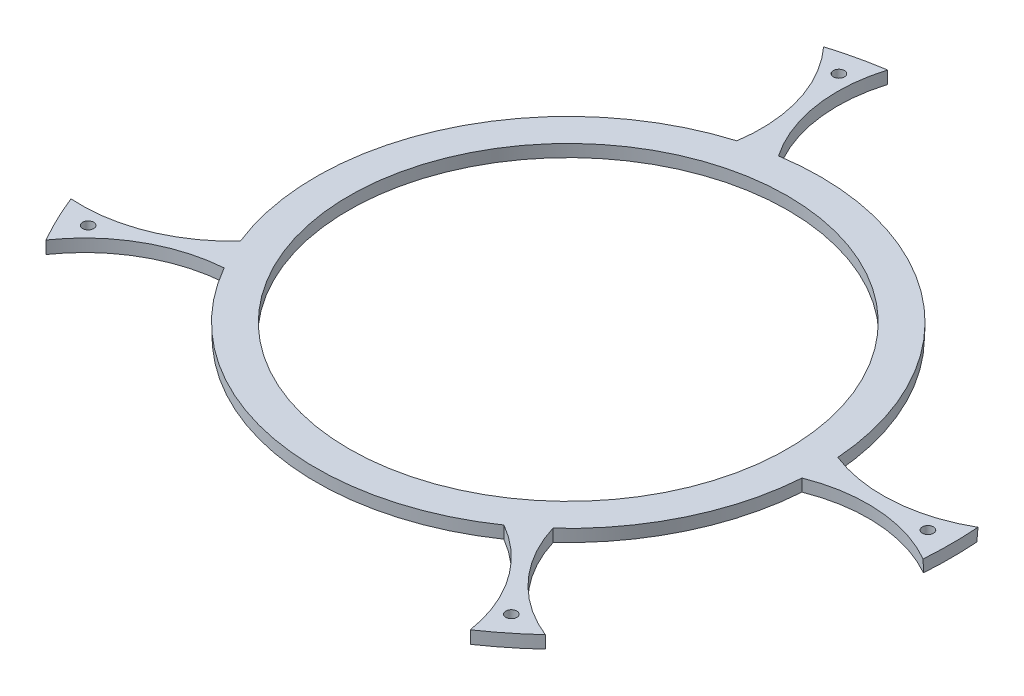
ISO-10303-21;
HEADER;
FILE_DESCRIPTION(('STEP AP214'),'2;1');
FILE_NAME('part.step','',(''),(''),'','','');
FILE_SCHEMA(('AUTOMOTIVE_DESIGN { 1 0 10303 214 1 1 1 1 }'));
ENDSEC;
DATA;
#1=APPLICATION_CONTEXT('core data for automotive mechanical design processes');
#2=APPLICATION_PROTOCOL_DEFINITION('international standard','automotive_design',2000,#1);
#3=PRODUCT_CONTEXT('',#1,'mechanical');
#4=PRODUCT('Part','Part','',(#3));
#5=PRODUCT_RELATED_PRODUCT_CATEGORY('part','',(#4));
#6=PRODUCT_DEFINITION_FORMATION('','',#4);
#7=PRODUCT_DEFINITION_CONTEXT('part definition',#1,'design');
#8=PRODUCT_DEFINITION('design','',#6,#7);
#9=PRODUCT_DEFINITION_SHAPE('','',#8);
#10=(LENGTH_UNIT() NAMED_UNIT(*) SI_UNIT(.MILLI.,.METRE.));
#11=(NAMED_UNIT(*) PLANE_ANGLE_UNIT() SI_UNIT($,.RADIAN.));
#12=(NAMED_UNIT(*) SI_UNIT($,.STERADIAN.) SOLID_ANGLE_UNIT());
#13=UNCERTAINTY_MEASURE_WITH_UNIT(LENGTH_MEASURE(1.E-05),#10,'distance_accuracy_value','');
#14=(GEOMETRIC_REPRESENTATION_CONTEXT(3) GLOBAL_UNCERTAINTY_ASSIGNED_CONTEXT((#13)) GLOBAL_UNIT_ASSIGNED_CONTEXT((#10,
#11,#12)) REPRESENTATION_CONTEXT('',''));
#15=CARTESIAN_POINT('',(0.,0.,0.));
#16=DIRECTION('',(0.,0.,1.));
#17=DIRECTION('',(1.,0.,0.));
#18=AXIS2_PLACEMENT_3D('',#15,#16,#17);
#19=CARTESIAN_POINT('',(0.,0.,0.));
#20=DIRECTION('',(0.,1.,0.));
#21=DIRECTION('',(0.,0.,1.));
#22=AXIS2_PLACEMENT_3D('',#19,#20,#21);
#23=CONICAL_SURFACE('',#22,63.5,0.0349065850398867);
#24=CARTESIAN_POINT('',(-9.84704634469965,3.191075,-62.8446522378874));
#25=CARTESIAN_POINT('',(-9.83538249234666,2.65654921550589,-62.8275860510492));
#26=CARTESIAN_POINT('',(-9.82369900814921,2.12202382325885,-62.810521041431));
#27=CARTESIAN_POINT('',(-9.80029277606541,1.05297382325886,-62.7763933766348));
#28=CARTESIAN_POINT('',(-9.78857002817905,0.518449215505895,-62.7593307214568));
#29=CARTESIAN_POINT('',(-9.77682764844824,-0.0160749999999916,-62.742269243499));
#30=B_SPLINE_CURVE_WITH_KNOTS('',3,(#24,#25,#26,#27,#28,#29),.UNSPECIFIED.,.F.,.F.,(4,2,4),(0.,
1.60477600300416,3.20955200600852),.UNSPECIFIED.);
#31=CARTESIAN_POINT('',(-9.84669556581402,3.175,-62.8441389998533));
#32=VERTEX_POINT('',#31);
#33=CARTESIAN_POINT('',(-9.77718077811927,0.,-62.7427823421306));
#34=VERTEX_POINT('',#33);
#35=EDGE_CURVE('E69',#32,#34,#30,.T.);
#36=ORIENTED_EDGE('',*,*,#35,.F.);
#37=CARTESIAN_POINT('',(0.,3.175,0.));
#38=DIRECTION('',(0.,1.,0.));
#39=DIRECTION('',(0.,0.,1.));
#40=AXIS2_PLACEMENT_3D('',#37,#38,#39);
#41=CIRCLE('',#40,63.6108734431363);
#42=CARTESIAN_POINT('',(63.4510131439968,3.175,-4.50690039817253));
#43=VERTEX_POINT('',#42);
#44=EDGE_CURVE('E169',#43,#32,#41,.T.);
#45=ORIENTED_EDGE('',*,*,#44,.F.);
#46=CARTESIAN_POINT('',(63.4510131439968,3.175,-4.50690039817253));
#47=CARTESIAN_POINT('',(63.4334045635181,2.64583343737004,-4.49399195016212));
#48=CARTESIAN_POINT('',(63.4157922772372,2.11666682272168,-4.48109069987186));
#49=CARTESIAN_POINT('',(63.3805602930712,1.05833348938835,-4.45530259473168));
#50=CARTESIAN_POINT('',(63.3629405951861,0.529166770703372,-4.44241573988174));
#51=CARTESIAN_POINT('',(63.3453171914988,0.,-4.42953608275197));
#52=B_SPLINE_CURVE_WITH_KNOTS('',3,(#46,#47,#48,#49,#50,#51),.UNSPECIFIED.,.F.,.F.,(4,2,4),(0.,
1.58885036064113,3.17770072128174),.UNSPECIFIED.);
#53=CARTESIAN_POINT('',(63.3453171914988,0.,-4.42953608275197));
#54=VERTEX_POINT('',#53);
#55=EDGE_CURVE('E289',#43,#54,#52,.T.);
#56=ORIENTED_EDGE('',*,*,#55,.T.);
#57=CARTESIAN_POINT('',(0.,0.,0.));
#58=DIRECTION('',(0.,1.,0.));
#59=DIRECTION('',(0.,0.,1.));
#60=AXIS2_PLACEMENT_3D('',#57,#58,#59);
#61=CIRCLE('',#60,63.5);
#62=EDGE_CURVE('E284',#54,#34,#61,.T.);
#63=ORIENTED_EDGE('',*,*,#62,.T.);
#64=EDGE_LOOP('',(#36,#45,#56,#63));
#65=FACE_BOUND('',#64,.T.);
#66=ADVANCED_FACE('F41',(#65),#23,.T.);
#67=CARTESIAN_POINT('',(-18.3954838543675,3.175,-60.8929338590481));
#68=VERTEX_POINT('',#67);
#69=CARTESIAN_POINT('',(-59.0774093343028,3.175,23.5839548537971));
#70=VERTEX_POINT('',#69);
#71=EDGE_CURVE('E61',#68,#70,#41,.T.);
#72=ORIENTED_EDGE('',*,*,#71,.F.);
#73=CARTESIAN_POINT('',(-18.3953904991494,3.191075,-60.8935484677932));
#74=CARTESIAN_POINT('',(-18.3984945260413,2.65654921550589,-60.8731116088867));
#75=CARTESIAN_POINT('',(-18.4016167513906,2.12202382325885,-60.8526672926807));
#76=CARTESIAN_POINT('',(-18.4078975990039,1.05297382325885,-60.81176374567));
#77=CARTESIAN_POINT('',(-18.4110562212679,0.518449215505887,-60.7913045148652));
#78=CARTESIAN_POINT('',(-18.4142330419893,-0.0160750000000003,-60.770837826761));
#79=B_SPLINE_CURVE_WITH_KNOTS('',3,(#73,#74,#75,#76,#77,#78),.UNSPECIFIED.,.F.,.F.,(4,2,4),(0.,
1.60477600300416,3.20955200600853),.UNSPECIFIED.);
#80=CARTESIAN_POINT('',(-18.4141375083022,0.,-60.7714533298764));
#81=VERTEX_POINT('',#80);
#82=EDGE_CURVE('E203',#68,#81,#79,.T.);
#83=ORIENTED_EDGE('',*,*,#82,.T.);
#84=CARTESIAN_POINT('',(-58.9940623950851,0.,23.4936289688249));
#85=VERTEX_POINT('',#84);
#86=EDGE_CURVE('E287',#81,#85,#61,.T.);
#87=ORIENTED_EDGE('',*,*,#86,.T.);
#88=CARTESIAN_POINT('',(-59.0778316487426,3.191075,23.5844110441304));
#89=CARTESIAN_POINT('',(-59.0637887981586,2.65654921550589,23.5692420450736));
#90=CARTESIAN_POINT('',(-59.0497514637756,2.12202382325885,23.5540541683397));
#91=CARTESIAN_POINT('',(-59.021687827412,1.05297382325885,23.523640659518));
#92=CARTESIAN_POINT('',(-59.0076615254312,0.518449215505887,23.5084150274302));
#93=CARTESIAN_POINT('',(-58.9936407396516,-0.0160750000000004,23.4931705176653));
#94=B_SPLINE_CURVE_WITH_KNOTS('',3,(#88,#89,#90,#91,#92,#93),.UNSPECIFIED.,.F.,.F.,(4,2,4),(0.,
1.60477600300416,3.20955200600853),.UNSPECIFIED.);
#95=EDGE_CURVE('E240',#70,#85,#94,.T.);
#96=ORIENTED_EDGE('',*,*,#95,.F.);
#97=EDGE_LOOP('',(#72,#83,#87,#96));
#98=FACE_BOUND('',#97,.T.);
#99=ADVANCED_FACE('F364',(#98),#23,.T.);
#100=CARTESIAN_POINT('',(-55.2728406259754,3.175,31.4842231813686));
#101=VERTEX_POINT('',#100);
#102=CARTESIAN_POINT('',(36.1386161673915,3.175,52.3482916789522));
#103=VERTEX_POINT('',#102);
#104=EDGE_CURVE('E375',#101,#103,#41,.T.);
#105=ORIENTED_EDGE('',*,*,#104,.F.);
#106=CARTESIAN_POINT('',(-55.2734605986864,3.191075,31.4842689300727));
#107=CARTESIAN_POINT('',(-55.252845423538,2.65654921550589,31.4827475035988));
#108=CARTESIAN_POINT('',(-55.2322189285226,2.12202382325885,31.4812421599037));
#109=CARTESIAN_POINT('',(-55.1909432987577,1.05297382325885,31.4782636380711));
#110=CARTESIAN_POINT('',(-55.1702941640082,0.518449215505887,31.4767904599336));
#111=CARTESIAN_POINT('',(-55.1496337093916,-0.0160750000000003,31.4753333645749));
#112=B_SPLINE_CURVE_WITH_KNOTS('',3,(#106,#107,#108,#109,#110,#111),.UNSPECIFIED.,.F.,.F.,(4,2,
4),(0.,1.60477600300416,3.20955200600853),.UNSPECIFIED.);
#113=CARTESIAN_POINT('',(-55.150255038804,0.,31.4753771884449));
#114=VERTEX_POINT('',#113);
#115=EDGE_CURVE('E232',#101,#114,#112,.T.);
#116=ORIENTED_EDGE('',*,*,#115,.T.);
#117=CARTESIAN_POINT('',(36.0320085021825,0.,52.2871338217983));
#118=VERTEX_POINT('',#117);
#119=EDGE_CURVE('E617',#114,#118,#61,.T.);
#120=ORIENTED_EDGE('',*,*,#119,.T.);
#121=CARTESIAN_POINT('',(36.1391548938843,3.191075,52.3486018931882));
#122=CARTESIAN_POINT('',(36.1212413850766,2.65654921550589,52.3382865460246));
#123=CARTESIAN_POINT('',(36.1033106993648,2.12202382325885,52.3279807774376));
#124=CARTESIAN_POINT('',(36.0674149741333,1.05297382325885,52.3073883974172));
#125=CARTESIAN_POINT('',(36.0494499346135,0.518449215505887,52.2971017859838));
#126=CARTESIAN_POINT('',(36.0314677181898,-0.0160749999999998,52.2868247531271));
#127=B_SPLINE_CURVE_WITH_KNOTS('',3,(#121,#122,#123,#124,#125,#126),.UNSPECIFIED.,.F.,.F.,(4,2,
4),(0.,1.60477600300416,3.20955200600853),.UNSPECIFIED.);
#128=EDGE_CURVE('E54',#103,#118,#127,.T.);
#129=ORIENTED_EDGE('',*,*,#128,.F.);
#130=EDGE_LOOP('',(#105,#116,#120,#129));
#131=FACE_BOUND('',#130,.T.);
#132=ADVANCED_FACE('F353',(#131),#23,.T.);
#133=CARTESIAN_POINT('',(0.,3.175,0.));
#134=DIRECTION('',(0.,1.,0.));
#135=DIRECTION('',(0.,0.,1.));
#136=AXIS2_PLACEMENT_3D('',#133,#134,#135);
#137=PLANE('',#136);
#138=CARTESIAN_POINT('',(-20.1777532492898,3.175,-88.4045132208236));
#139=DIRECTION('',(0.,1.,0.));
#140=DIRECTION('',(0.974927912181826,0.,-0.222520933956305));
#141=AXIS2_PLACEMENT_3D('',#138,#139,#140);
#142=CIRCLE('',#141,1.39699999999999);
#143=CARTESIAN_POINT('',(-18.8157789559718,3.175,-88.7153749655605));
#144=VERTEX_POINT('',#143);
#145=EDGE_CURVE('E577',#144,#144,#142,.T.);
#146=ORIENTED_EDGE('',*,*,#145,.F.);
#147=EDGE_LOOP('',(#146));
#148=FACE_BOUND('',#147,.T.);
#149=CARTESIAN_POINT('',(-81.6980550036558,3.175,39.3437096957014));
#150=DIRECTION('',(0.,1.,0.));
#151=DIRECTION('',(-0.433883739117553,0.,-0.900968867902422));
#152=AXIS2_PLACEMENT_3D('',#149,#150,#151);
#153=CIRCLE('',#152,1.39699999999999);
#154=CARTESIAN_POINT('',(-82.304190587203,3.175,38.0850561872418));
#155=VERTEX_POINT('',#154);
#156=EDGE_CURVE('E579',#155,#155,#153,.T.);
#157=ORIENTED_EDGE('',*,*,#156,.F.);
#158=EDGE_LOOP('',(#157));
#159=FACE_BOUND('',#158,.T.);
#160=CARTESIAN_POINT('',(56.5368082529461,3.175,70.8949151672361));
#161=DIRECTION('',(0.,1.,0.));
#162=DIRECTION('',(-0.781831482468031,0.,0.623489801858732));
#163=AXIS2_PLACEMENT_3D('',#160,#161,#162);
#164=CIRCLE('',#163,1.39699999999999);
#165=CARTESIAN_POINT('',(55.4445896719383,3.175,71.7659304204328));
#166=VERTEX_POINT('',#165);
#167=EDGE_CURVE('E189',#166,#166,#164,.T.);
#168=ORIENTED_EDGE('',*,*,#167,.F.);
#169=EDGE_LOOP('',(#168));
#170=FACE_BOUND('',#169,.T.);
#171=ORIENTED_EDGE('',*,*,#44,.T.);
#172=CARTESIAN_POINT('',(21.6082989864043,3.175,-84.3428207668807));
#173=DIRECTION('',(0.,-1.,0.));
#174=DIRECTION('',(-0.974927912181826,0.,0.222520933956305));
#175=AXIS2_PLACEMENT_3D('',#172,#173,#174);
#176=CIRCLE('',#175,38.1);
#177=CARTESIAN_POINT('',(-14.8613147827413,3.175,-95.3690291600385));
#178=VERTEX_POINT('',#177);
#179=EDGE_CURVE('E160',#32,#178,#176,.T.);
#180=ORIENTED_EDGE('',*,*,#179,.T.);
#181=CARTESIAN_POINT('',(0.,3.175,0.));
#182=DIRECTION('',(0.,-1.,0.));
#183=DIRECTION('',(-0.974927912181826,0.,0.222520933956305));
#184=AXIS2_PLACEMENT_3D('',#181,#182,#183);
#185=CIRCLE('',#184,96.52);
#186=CARTESIAN_POINT('',(-27.9894890126193,3.175,-92.3726090614121));
#187=VERTEX_POINT('',#186);
#188=EDGE_CURVE('E166',#178,#187,#185,.F.);
#189=ORIENTED_EDGE('',*,*,#188,.T.);
#190=CARTESIAN_POINT('',(-56.0633831171326,3.175,-66.614766181843));
#191=DIRECTION('',(0.,-1.,0.));
#192=DIRECTION('',(-0.974927912181826,0.,0.222520933956305));
#193=AXIS2_PLACEMENT_3D('',#190,#191,#192);
#194=CIRCLE('',#193,38.1);
#195=EDGE_CURVE('E171',#68,#187,#194,.F.);
#196=ORIENTED_EDGE('',*,*,#195,.F.);
#197=ORIENTED_EDGE('',*,*,#71,.T.);
#198=CARTESIAN_POINT('',(-87.0364690294427,3.175,-2.29849056705918));
#199=DIRECTION('',(0.,-1.,0.));
#200=DIRECTION('',(0.433883739117553,0.,0.900968867902422));
#201=AXIS2_PLACEMENT_3D('',#198,#199,#200);
#202=CIRCLE('',#201,38.1);
#203=CARTESIAN_POINT('',(-89.6709748405293,3.175,35.7103160326139));
#204=VERTEX_POINT('',#203);
#205=EDGE_CURVE('E388',#70,#204,#202,.T.);
#206=ORIENTED_EDGE('',*,*,#205,.T.);
#207=CARTESIAN_POINT('',(0.,3.175,0.));
#208=DIRECTION('',(0.,-1.,0.));
#209=DIRECTION('',(0.433883739117553,0.,0.900968867902422));
#210=AXIS2_PLACEMENT_3D('',#207,#208,#209);
#211=CIRCLE('',#210,96.52);
#212=CARTESIAN_POINT('',(-83.8283876589821,3.175,47.8425733264362));
#213=VERTEX_POINT('',#212);
#214=EDGE_CURVE('E385',#204,#213,#211,.F.);
#215=ORIENTED_EDGE('',*,*,#214,.T.);
#216=CARTESIAN_POINT('',(-52.4693185421692,3.175,69.4809370383012));
#217=DIRECTION('',(0.,-1.,0.));
#218=DIRECTION('',(0.433883739117553,0.,0.900968867902422));
#219=AXIS2_PLACEMENT_3D('',#216,#217,#218);
#220=CIRCLE('',#219,38.1);
#221=EDGE_CURVE('E380',#101,#213,#220,.F.);
#222=ORIENTED_EDGE('',*,*,#221,.F.);
#223=ORIENTED_EDGE('',*,*,#104,.T.);
#224=CARTESIAN_POINT('',(17.1265737669792,3.175,85.3657453022243));
#225=DIRECTION('',(0.,-1.,0.));
#226=DIRECTION('',(0.781831482468031,0.,-0.623489801858732));
#227=AXIS2_PLACEMENT_3D('',#224,#225,#226);
#228=CIRCLE('',#227,38.1);
#229=CARTESIAN_POINT('',(54.7686529233175,3.175,79.4764434091334));
#230=VERTEX_POINT('',#229);
#231=EDGE_CURVE('E248',#103,#230,#228,.T.);
#232=ORIENTED_EDGE('',*,*,#231,.T.);
#233=CARTESIAN_POINT('',(0.,3.175,0.));
#234=DIRECTION('',(0.,-1.,0.));
#235=DIRECTION('',(0.781831482468031,0.,-0.623489801858732));
#236=AXIS2_PLACEMENT_3D('',#233,#234,#235);
#237=CIRCLE('',#236,96.52);
#238=CARTESIAN_POINT('',(65.2966312404772,3.175,71.0806608624676));
#239=VERTEX_POINT('',#238);
#240=EDGE_CURVE('E245',#230,#239,#237,.F.);
#241=ORIENTED_EDGE('',*,*,#240,.T.);
#242=CARTESIAN_POINT('',(79.4144266492428,3.175,35.6928401779971));
#243=DIRECTION('',(0.,-1.,0.));
#244=DIRECTION('',(0.781831482468031,0.,-0.623489801858732));
#245=AXIS2_PLACEMENT_3D('',#242,#243,#244);
#246=CIRCLE('',#245,38.1);
#247=CARTESIAN_POINT('',(42.9942120913891,3.175,46.8811363646335));
#248=VERTEX_POINT('',#247);
#249=EDGE_CURVE('E251',#248,#239,#246,.F.);
#250=ORIENTED_EDGE('',*,*,#249,.F.);
#251=CARTESIAN_POINT('',(63.4510131439968,3.175,4.50690039817253));
#252=VERTEX_POINT('',#251);
#253=EDGE_CURVE('E286',#248,#252,#41,.T.);
#254=ORIENTED_EDGE('',*,*,#253,.T.);
#255=CARTESIAN_POINT('',(77.4198712861191,3.175,39.8345770661714));
#256=DIRECTION('',(0.,1.,0.));
#257=DIRECTION('',(0.,0.,1.));
#258=AXIS2_PLACEMENT_3D('',#255,#256,#257);
#259=CIRCLE('',#258,37.9891265568637);
#260=CARTESIAN_POINT('',(96.382997571437,3.175,6.91689825917626));
#261=VERTEX_POINT('',#260);
#262=EDGE_CURVE('E327',#252,#261,#259,.F.);
#263=ORIENTED_EDGE('',*,*,#262,.T.);
#264=CARTESIAN_POINT('',(0.,3.175,0.));
#265=DIRECTION('',(0.,1.,0.));
#266=DIRECTION('',(0.,0.,1.));
#267=AXIS2_PLACEMENT_3D('',#264,#265,#266);
#268=CIRCLE('',#267,96.6308734431363);
#269=CARTESIAN_POINT('',(96.382997571437,3.175,-6.91689825917626));
#270=VERTEX_POINT('',#269);
#271=EDGE_CURVE('E278',#261,#270,#268,.T.);
#272=ORIENTED_EDGE('',*,*,#271,.T.);
#273=CARTESIAN_POINT('',(77.4198712861191,3.175,-39.8345770661714));
#274=DIRECTION('',(0.,1.,0.));
#275=DIRECTION('',(0.,0.,1.));
#276=AXIS2_PLACEMENT_3D('',#273,#274,#275);
#277=CIRCLE('',#276,37.9891265568637);
#278=EDGE_CURVE('E319',#43,#270,#277,.T.);
#279=ORIENTED_EDGE('',*,*,#278,.F.);
#280=EDGE_LOOP('',(#171,#180,#189,#196,#197,#206,#215,#222,#223,#232,#241,#250,#254,#263,#272,#279));
#281=FACE_BOUND('',#280,.T.);
#282=CARTESIAN_POINT('',(90.678,3.175,0.));
#283=DIRECTION('',(0.,1.,0.));
#284=DIRECTION('',(0.,0.,1.));
#285=AXIS2_PLACEMENT_3D('',#282,#283,#284);
#286=CIRCLE('',#285,1.39699999999999);
#287=CARTESIAN_POINT('',(90.678,3.175,1.39699999999999));
#288=VERTEX_POINT('',#287);
#289=EDGE_CURVE('E262',#288,#288,#286,.T.);
#290=ORIENTED_EDGE('',*,*,#289,.F.);
#291=EDGE_LOOP('',(#290));
#292=FACE_BOUND('',#291,.T.);
#293=CARTESIAN_POINT('',(0.,3.175,0.));
#294=DIRECTION('',(0.,1.,0.));
#295=DIRECTION('',(0.,0.,1.));
#296=AXIS2_PLACEMENT_3D('',#293,#294,#295);
#297=CIRCLE('',#296,55.2611265568637);
#298=CARTESIAN_POINT('',(0.,3.175,55.2611265568637));
#299=VERTEX_POINT('',#298);
#300=EDGE_CURVE('E282',#299,#299,#297,.T.);
#301=ORIENTED_EDGE('',*,*,#300,.F.);
#302=EDGE_LOOP('',(#301));
#303=FACE_BOUND('',#302,.T.);
#304=ADVANCED_FACE('F162',(#148,#159,#170,#281,#292,#303),#137,.T.);
#305=CARTESIAN_POINT('',(0.,0.,0.));
#306=DIRECTION('',(0.,1.,0.));
#307=DIRECTION('',(0.,0.,1.));
#308=AXIS2_PLACEMENT_3D('',#305,#306,#307);
#309=PLANE('',#308);
#310=CARTESIAN_POINT('',(-20.1777532492898,0.,-88.4045132208236));
#311=DIRECTION('',(0.,1.,0.));
#312=DIRECTION('',(0.974927912181826,0.,-0.222520933956305));
#313=AXIS2_PLACEMENT_3D('',#310,#311,#312);
#314=CIRCLE('',#313,1.39699999999999);
#315=CARTESIAN_POINT('',(-18.8157789559718,0.,-88.7153749655605));
#316=VERTEX_POINT('',#315);
#317=EDGE_CURVE('E574',#316,#316,#314,.T.);
#318=ORIENTED_EDGE('',*,*,#317,.T.);
#319=EDGE_LOOP('',(#318));
#320=FACE_BOUND('',#319,.T.);
#321=CARTESIAN_POINT('',(-81.6980550036558,0.,39.3437096957014));
#322=DIRECTION('',(0.,1.,0.));
#323=DIRECTION('',(-0.433883739117553,0.,-0.900968867902422));
#324=AXIS2_PLACEMENT_3D('',#321,#322,#323);
#325=CIRCLE('',#324,1.39699999999999);
#326=CARTESIAN_POINT('',(-82.304190587203,0.,38.0850561872418));
#327=VERTEX_POINT('',#326);
#328=EDGE_CURVE('E582',#327,#327,#325,.T.);
#329=ORIENTED_EDGE('',*,*,#328,.T.);
#330=EDGE_LOOP('',(#329));
#331=FACE_BOUND('',#330,.T.);
#332=CARTESIAN_POINT('',(56.5368082529461,0.,70.8949151672361));
#333=DIRECTION('',(0.,1.,0.));
#334=DIRECTION('',(-0.781831482468031,0.,0.623489801858732));
#335=AXIS2_PLACEMENT_3D('',#332,#333,#334);
#336=CIRCLE('',#335,1.39699999999999);
#337=CARTESIAN_POINT('',(55.4445896719383,0.,71.7659304204328));
#338=VERTEX_POINT('',#337);
#339=EDGE_CURVE('E195',#338,#338,#336,.T.);
#340=ORIENTED_EDGE('',*,*,#339,.T.);
#341=EDGE_LOOP('',(#340));
#342=FACE_BOUND('',#341,.T.);
#343=CARTESIAN_POINT('',(90.678,0.,0.));
#344=DIRECTION('',(0.,1.,0.));
#345=DIRECTION('',(0.,0.,1.));
#346=AXIS2_PLACEMENT_3D('',#343,#344,#345);
#347=CIRCLE('',#346,1.39699999999999);
#348=CARTESIAN_POINT('',(90.678,0.,1.39699999999999));
#349=VERTEX_POINT('',#348);
#350=EDGE_CURVE('E265',#349,#349,#347,.T.);
#351=ORIENTED_EDGE('',*,*,#350,.T.);
#352=EDGE_LOOP('',(#351));
#353=FACE_BOUND('',#352,.T.);
#354=ORIENTED_EDGE('',*,*,#62,.F.);
#355=CARTESIAN_POINT('',(77.4198712861191,0.,-39.8345770661714));
#356=DIRECTION('',(0.,-1.,0.));
#357=DIRECTION('',(0.,0.,-1.));
#358=AXIS2_PLACEMENT_3D('',#355,#356,#357);
#359=CIRCLE('',#358,38.1);
#360=CARTESIAN_POINT('',(96.2848821310782,0.,-6.73289484578299));
#361=VERTEX_POINT('',#360);
#362=EDGE_CURVE('E275',#54,#361,#359,.F.);
#363=ORIENTED_EDGE('',*,*,#362,.T.);
#364=CARTESIAN_POINT('',(0.,0.,0.));
#365=DIRECTION('',(0.,-1.,0.));
#366=DIRECTION('',(0.,0.,-1.));
#367=AXIS2_PLACEMENT_3D('',#364,#365,#366);
#368=CIRCLE('',#367,96.52);
#369=CARTESIAN_POINT('',(96.2848821310782,0.,6.73289484578299));
#370=VERTEX_POINT('',#369);
#371=EDGE_CURVE('E268',#370,#361,#368,.F.);
#372=ORIENTED_EDGE('',*,*,#371,.F.);
#373=CARTESIAN_POINT('',(77.4198712861191,0.,39.8345770661714));
#374=DIRECTION('',(0.,-1.,0.));
#375=DIRECTION('',(0.,0.,-1.));
#376=AXIS2_PLACEMENT_3D('',#373,#374,#375);
#377=CIRCLE('',#376,38.1);
#378=CARTESIAN_POINT('',(63.3453171914988,0.,4.42953608275198));
#379=VERTEX_POINT('',#378);
#380=EDGE_CURVE('E273',#379,#370,#377,.T.);
#381=ORIENTED_EDGE('',*,*,#380,.F.);
#382=CARTESIAN_POINT('',(42.9583100266298,0.,46.7635926726761));
#383=VERTEX_POINT('',#382);
#384=EDGE_CURVE('E288',#383,#379,#61,.T.);
#385=ORIENTED_EDGE('',*,*,#384,.F.);
#386=CARTESIAN_POINT('',(79.4144266492428,0.,35.6928401779971));
#387=DIRECTION('',(0.,-1.,0.));
#388=DIRECTION('',(0.781831482468031,0.,-0.623489801858732));
#389=AXIS2_PLACEMENT_3D('',#386,#387,#388);
#390=CIRCLE('',#389,38.1);
#391=CARTESIAN_POINT('',(65.2966312404772,0.,71.0806608624676));
#392=VERTEX_POINT('',#391);
#393=EDGE_CURVE('E249',#383,#392,#390,.F.);
#394=ORIENTED_EDGE('',*,*,#393,.T.);
#395=CARTESIAN_POINT('',(0.,0.,0.));
#396=DIRECTION('',(0.,-1.,0.));
#397=DIRECTION('',(0.781831482468031,0.,-0.623489801858732));
#398=AXIS2_PLACEMENT_3D('',#395,#396,#397);
#399=CIRCLE('',#398,96.52);
#400=CARTESIAN_POINT('',(54.7686529233175,0.,79.4764434091334));
#401=VERTEX_POINT('',#400);
#402=EDGE_CURVE('E239',#401,#392,#399,.F.);
#403=ORIENTED_EDGE('',*,*,#402,.F.);
#404=CARTESIAN_POINT('',(17.1265737669792,0.,85.3657453022243));
#405=DIRECTION('',(0.,-1.,0.));
#406=DIRECTION('',(0.781831482468031,0.,-0.623489801858732));
#407=AXIS2_PLACEMENT_3D('',#404,#405,#406);
#408=CIRCLE('',#407,38.1);
#409=EDGE_CURVE('E256',#118,#401,#408,.T.);
#410=ORIENTED_EDGE('',*,*,#409,.F.);
#411=ORIENTED_EDGE('',*,*,#119,.F.);
#412=CARTESIAN_POINT('',(-52.4693185421692,0.,69.4809370383012));
#413=DIRECTION('',(0.,-1.,0.));
#414=DIRECTION('',(0.433883739117553,0.,0.900968867902422));
#415=AXIS2_PLACEMENT_3D('',#412,#413,#414);
#416=CIRCLE('',#415,38.1);
#417=CARTESIAN_POINT('',(-83.8283876589821,0.,47.8425733264362));
#418=VERTEX_POINT('',#417);
#419=EDGE_CURVE('E383',#114,#418,#416,.F.);
#420=ORIENTED_EDGE('',*,*,#419,.T.);
#421=CARTESIAN_POINT('',(0.,0.,0.));
#422=DIRECTION('',(0.,-1.,0.));
#423=DIRECTION('',(0.433883739117553,0.,0.900968867902422));
#424=AXIS2_PLACEMENT_3D('',#421,#422,#423);
#425=CIRCLE('',#424,96.52);
#426=CARTESIAN_POINT('',(-89.6709748405293,0.,35.7103160326139));
#427=VERTEX_POINT('',#426);
#428=EDGE_CURVE('E394',#427,#418,#425,.F.);
#429=ORIENTED_EDGE('',*,*,#428,.F.);
#430=CARTESIAN_POINT('',(-87.0364690294427,0.,-2.29849056705918));
#431=DIRECTION('',(0.,-1.,0.));
#432=DIRECTION('',(0.433883739117553,0.,0.900968867902422));
#433=AXIS2_PLACEMENT_3D('',#430,#431,#432);
#434=CIRCLE('',#433,38.1);
#435=EDGE_CURVE('E397',#85,#427,#434,.T.);
#436=ORIENTED_EDGE('',*,*,#435,.F.);
#437=ORIENTED_EDGE('',*,*,#86,.F.);
#438=CARTESIAN_POINT('',(-56.0633831171326,0.,-66.614766181843));
#439=DIRECTION('',(0.,-1.,0.));
#440=DIRECTION('',(-0.974927912181826,0.,0.222520933956305));
#441=AXIS2_PLACEMENT_3D('',#438,#439,#440);
#442=CIRCLE('',#441,38.1);
#443=CARTESIAN_POINT('',(-27.9894890126193,0.,-92.3726090614121));
#444=VERTEX_POINT('',#443);
#445=EDGE_CURVE('E184',#81,#444,#442,.F.);
#446=ORIENTED_EDGE('',*,*,#445,.T.);
#447=CARTESIAN_POINT('',(0.,0.,0.));
#448=DIRECTION('',(0.,-1.,0.));
#449=DIRECTION('',(-0.974927912181826,0.,0.222520933956305));
#450=AXIS2_PLACEMENT_3D('',#447,#448,#449);
#451=CIRCLE('',#450,96.52);
#452=CARTESIAN_POINT('',(-14.8613147827413,0.,-95.3690291600385));
#453=VERTEX_POINT('',#452);
#454=EDGE_CURVE('E193',#453,#444,#451,.F.);
#455=ORIENTED_EDGE('',*,*,#454,.F.);
#456=CARTESIAN_POINT('',(21.6082989864043,0.,-84.3428207668807));
#457=DIRECTION('',(0.,-1.,0.));
#458=DIRECTION('',(-0.974927912181826,0.,0.222520933956305));
#459=AXIS2_PLACEMENT_3D('',#456,#457,#458);
#460=CIRCLE('',#459,38.1);
#461=EDGE_CURVE('E177',#34,#453,#460,.T.);
#462=ORIENTED_EDGE('',*,*,#461,.F.);
#463=EDGE_LOOP('',(#354,#363,#372,#381,#385,#394,#403,#410,#411,#420,#429,#436,#437,#446,#455,#462));
#464=FACE_BOUND('',#463,.T.);
#465=CARTESIAN_POINT('',(0.,0.,0.));
#466=DIRECTION('',(0.,1.,0.));
#467=DIRECTION('',(0.,0.,1.));
#468=AXIS2_PLACEMENT_3D('',#465,#466,#467);
#469=CIRCLE('',#468,55.372);
#470=CARTESIAN_POINT('',(0.,0.,55.372));
#471=VERTEX_POINT('',#470);
#472=EDGE_CURVE('E279',#471,#471,#469,.T.);
#473=ORIENTED_EDGE('',*,*,#472,.T.);
#474=EDGE_LOOP('',(#473));
#475=FACE_BOUND('',#474,.T.);
#476=ADVANCED_FACE('F352',(#320,#331,#342,#353,#464,#475),#309,.F.);
#477=ORIENTED_EDGE('',*,*,#253,.F.);
#478=CARTESIAN_POINT('',(42.9943946499842,3.191075,46.8817306132899));
#479=CARTESIAN_POINT('',(42.9883240608209,2.65654921550589,46.8619708528631));
#480=CARTESIAN_POINT('',(42.9822666323,2.12202382325885,46.8421964776271));
#481=CARTESIAN_POINT('',(42.9701780965434,1.05297382325885,46.8026184975364));
#482=CARTESIAN_POINT('',(42.9641469893077,0.518449215505887,46.7828148926817));
#483=CARTESIAN_POINT('',(42.9581290427146,-0.0160749999999998,46.7629966730177));
#484=B_SPLINE_CURVE_WITH_KNOTS('',3,(#478,#479,#480,#481,#482,#483),.UNSPECIFIED.,.F.,.F.,(4,2,
4),(0.,1.60477600300416,3.20955200600853),.UNSPECIFIED.);
#485=EDGE_CURVE('E11',#248,#383,#484,.T.);
#486=ORIENTED_EDGE('',*,*,#485,.T.);
#487=ORIENTED_EDGE('',*,*,#384,.T.);
#488=CARTESIAN_POINT('',(63.4510131439968,3.175,4.50690039817253));
#489=CARTESIAN_POINT('',(63.4334045635181,2.64583343737004,4.49399195016212));
#490=CARTESIAN_POINT('',(63.4157922772372,2.11666682272168,4.48109069987186));
#491=CARTESIAN_POINT('',(63.3805602930712,1.05833348938835,4.45530259473168));
#492=CARTESIAN_POINT('',(63.3629405951861,0.529166770703373,4.44241573988175));
#493=CARTESIAN_POINT('',(63.3453171914988,0.,4.42953608275197));
#494=B_SPLINE_CURVE_WITH_KNOTS('',3,(#488,#489,#490,#491,#492,#493),.UNSPECIFIED.,.F.,.F.,(4,2,
4),(0.,1.58885036064113,3.17770072128174),.UNSPECIFIED.);
#495=EDGE_CURVE('E295',#252,#379,#494,.T.);
#496=ORIENTED_EDGE('',*,*,#495,.F.);
#497=EDGE_LOOP('',(#477,#486,#487,#496));
#498=FACE_BOUND('',#497,.T.);
#499=ADVANCED_FACE('F209',(#498),#23,.T.);
#500=CARTESIAN_POINT('',(0.,0.,0.));
#501=DIRECTION('',(0.,-1.,0.));
#502=DIRECTION('',(0.,0.,1.));
#503=AXIS2_PLACEMENT_3D('',#500,#501,#502);
#504=CONICAL_SURFACE('',#503,55.372,0.0349065850398867);
#505=ORIENTED_EDGE('',*,*,#300,.T.);
#506=EDGE_LOOP('',(#505));
#507=FACE_BOUND('',#506,.T.);
#508=ORIENTED_EDGE('',*,*,#472,.F.);
#509=EDGE_LOOP('',(#508));
#510=FACE_BOUND('',#509,.T.);
#511=ADVANCED_FACE('F43',(#507,#510),#504,.F.);
#512=CARTESIAN_POINT('',(0.,0.,0.));
#513=DIRECTION('',(0.,1.,0.));
#514=DIRECTION('',(0.,0.,-1.));
#515=AXIS2_PLACEMENT_3D('',#512,#513,#514);
#516=CONICAL_SURFACE('',#515,96.52,0.0349065850398867);
#517=ORIENTED_EDGE('',*,*,#371,.T.);
#518=CARTESIAN_POINT('',(96.382997571437,3.175,-6.91689825917626));
#519=CARTESIAN_POINT('',(96.3666763667549,2.64583587976127,-6.88617035802929));
#520=CARTESIAN_POINT('',(96.3503394777172,2.11667048630692,-6.85547278967293));
#521=CARTESIAN_POINT('',(96.3176343309309,1.05833715297359,-6.79413831854185));
#522=CARTESIAN_POINT('',(96.3012660731824,0.529169213094598,-6.76350141576711));
#523=CARTESIAN_POINT('',(96.2848821310782,0.,-6.732894845783));
#524=B_SPLINE_CURVE_WITH_KNOTS('',3,(#518,#519,#520,#521,#522,#523),.UNSPECIFIED.,.F.,.F.,(4,2,
4),(0.,1.59092024768214,3.18184049534453),.UNSPECIFIED.);
#525=EDGE_CURVE('E283',#270,#361,#524,.T.);
#526=ORIENTED_EDGE('',*,*,#525,.F.);
#527=ORIENTED_EDGE('',*,*,#271,.F.);
#528=CARTESIAN_POINT('',(96.382997571437,3.175,6.91689825917626));
#529=CARTESIAN_POINT('',(96.3666763667549,2.64583587976127,6.88617035802929));
#530=CARTESIAN_POINT('',(96.3503394777172,2.11667048630692,6.85547278967293));
#531=CARTESIAN_POINT('',(96.3176343309309,1.05833715297359,6.79413831854185));
#532=CARTESIAN_POINT('',(96.3012660731824,0.529169213094598,6.76350141576711));
#533=CARTESIAN_POINT('',(96.2848821310782,0.,6.732894845783));
#534=B_SPLINE_CURVE_WITH_KNOTS('',3,(#528,#529,#530,#531,#532,#533),.UNSPECIFIED.,.F.,.F.,(4,2,
4),(0.,1.59092024768214,3.18184049534453),.UNSPECIFIED.);
#535=EDGE_CURVE('E313',#261,#370,#534,.T.);
#536=ORIENTED_EDGE('',*,*,#535,.T.);
#537=EDGE_LOOP('',(#517,#526,#527,#536));
#538=FACE_BOUND('',#537,.T.);
#539=ADVANCED_FACE('F305',(#538),#516,.T.);
#540=CARTESIAN_POINT('',(77.4198712861191,0.,-39.8345770661714));
#541=DIRECTION('',(0.,-1.,0.));
#542=DIRECTION('',(0.,0.,-1.));
#543=AXIS2_PLACEMENT_3D('',#540,#541,#542);
#544=CONICAL_SURFACE('',#543,38.1,0.0349065850398867);
#545=ORIENTED_EDGE('',*,*,#362,.F.);
#546=ORIENTED_EDGE('',*,*,#55,.F.);
#547=ORIENTED_EDGE('',*,*,#278,.T.);
#548=ORIENTED_EDGE('',*,*,#525,.T.);
#549=EDGE_LOOP('',(#545,#546,#547,#548));
#550=FACE_BOUND('',#549,.T.);
#551=ADVANCED_FACE('F301',(#550),#544,.F.);
#552=CARTESIAN_POINT('',(77.4198712861191,0.,39.8345770661714));
#553=DIRECTION('',(0.,-1.,0.));
#554=DIRECTION('',(0.,0.,-1.));
#555=AXIS2_PLACEMENT_3D('',#552,#553,#554);
#556=CONICAL_SURFACE('',#555,38.1,0.0349065850398867);
#557=ORIENTED_EDGE('',*,*,#380,.T.);
#558=ORIENTED_EDGE('',*,*,#535,.F.);
#559=ORIENTED_EDGE('',*,*,#262,.F.);
#560=ORIENTED_EDGE('',*,*,#495,.T.);
#561=EDGE_LOOP('',(#557,#558,#559,#560));
#562=FACE_BOUND('',#561,.T.);
#563=ADVANCED_FACE('F304',(#562),#556,.F.);
#564=CARTESIAN_POINT('',(90.678,0.,0.));
#565=DIRECTION('',(0.,1.,0.));
#566=DIRECTION('',(0.,0.,1.));
#567=AXIS2_PLACEMENT_3D('',#564,#565,#566);
#568=CYLINDRICAL_SURFACE('',#567,1.39699999999999);
#569=ORIENTED_EDGE('',*,*,#350,.F.);
#570=EDGE_LOOP('',(#569));
#571=FACE_BOUND('',#570,.T.);
#572=ORIENTED_EDGE('',*,*,#289,.T.);
#573=EDGE_LOOP('',(#572));
#574=FACE_BOUND('',#573,.T.);
#575=ADVANCED_FACE('F347',(#571,#574),#568,.F.);
#576=CARTESIAN_POINT('',(79.4144266492428,3.175,35.6928401779971));
#577=DIRECTION('',(0.,-1.,0.));
#578=DIRECTION('',(0.,0.,-1.));
#579=AXIS2_PLACEMENT_3D('',#576,#577,#578);
#580=CYLINDRICAL_SURFACE('',#579,38.1);
#581=ORIENTED_EDGE('',*,*,#485,.F.);
#582=ORIENTED_EDGE('',*,*,#249,.T.);
#583=DIRECTION('',(0.,-1.,0.));
#584=VECTOR('',#583,1.);
#585=CARTESIAN_POINT('',(65.2966312404772,3.175,71.0806608624676));
#586=LINE('',#585,#584);
#587=EDGE_CURVE('E260',#239,#392,#586,.T.);
#588=ORIENTED_EDGE('',*,*,#587,.T.);
#589=ORIENTED_EDGE('',*,*,#393,.F.);
#590=EDGE_LOOP('',(#581,#582,#588,#589));
#591=FACE_BOUND('',#590,.T.);
#592=ADVANCED_FACE('F341',(#591),#580,.F.);
#593=CARTESIAN_POINT('',(17.1265737669792,3.175,85.3657453022243));
#594=DIRECTION('',(0.,-1.,0.));
#595=DIRECTION('',(0.,0.,-1.));
#596=AXIS2_PLACEMENT_3D('',#593,#594,#595);
#597=CYLINDRICAL_SURFACE('',#596,38.1);
#598=ORIENTED_EDGE('',*,*,#231,.F.);
#599=ORIENTED_EDGE('',*,*,#128,.T.);
#600=ORIENTED_EDGE('',*,*,#409,.T.);
#601=DIRECTION('',(0.,-1.,0.));
#602=VECTOR('',#601,1.);
#603=CARTESIAN_POINT('',(54.7686529233175,3.175,79.4764434091334));
#604=LINE('',#603,#602);
#605=EDGE_CURVE('E253',#230,#401,#604,.T.);
#606=ORIENTED_EDGE('',*,*,#605,.F.);
#607=EDGE_LOOP('',(#598,#599,#600,#606));
#608=FACE_BOUND('',#607,.T.);
#609=ADVANCED_FACE('F337',(#608),#597,.F.);
#610=CARTESIAN_POINT('',(0.,3.175,0.));
#611=DIRECTION('',(0.,-1.,0.));
#612=DIRECTION('',(0.,0.,-1.));
#613=AXIS2_PLACEMENT_3D('',#610,#611,#612);
#614=CYLINDRICAL_SURFACE('',#613,96.52);
#615=ORIENTED_EDGE('',*,*,#402,.T.);
#616=ORIENTED_EDGE('',*,*,#587,.F.);
#617=ORIENTED_EDGE('',*,*,#240,.F.);
#618=ORIENTED_EDGE('',*,*,#605,.T.);
#619=EDGE_LOOP('',(#615,#616,#617,#618));
#620=FACE_BOUND('',#619,.T.);
#621=ADVANCED_FACE('F227',(#620),#614,.T.);
#622=CARTESIAN_POINT('',(-52.4693185421692,3.175,69.4809370383012));
#623=DIRECTION('',(0.,-1.,0.));
#624=DIRECTION('',(0.,0.,-1.));
#625=AXIS2_PLACEMENT_3D('',#622,#623,#624);
#626=CYLINDRICAL_SURFACE('',#625,38.1);
#627=ORIENTED_EDGE('',*,*,#115,.F.);
#628=ORIENTED_EDGE('',*,*,#221,.T.);
#629=DIRECTION('',(0.,-1.,0.));
#630=VECTOR('',#629,1.);
#631=CARTESIAN_POINT('',(-83.8283876589821,3.175,47.8425733264362));
#632=LINE('',#631,#630);
#633=EDGE_CURVE('E391',#213,#418,#632,.T.);
#634=ORIENTED_EDGE('',*,*,#633,.T.);
#635=ORIENTED_EDGE('',*,*,#419,.F.);
#636=EDGE_LOOP('',(#627,#628,#634,#635));
#637=FACE_BOUND('',#636,.T.);
#638=ADVANCED_FACE('F222',(#637),#626,.F.);
#639=CARTESIAN_POINT('',(-87.0364690294427,3.175,-2.29849056705918));
#640=DIRECTION('',(0.,-1.,0.));
#641=DIRECTION('',(0.,0.,-1.));
#642=AXIS2_PLACEMENT_3D('',#639,#640,#641);
#643=CYLINDRICAL_SURFACE('',#642,38.1);
#644=ORIENTED_EDGE('',*,*,#205,.F.);
#645=ORIENTED_EDGE('',*,*,#95,.T.);
#646=ORIENTED_EDGE('',*,*,#435,.T.);
#647=DIRECTION('',(0.,-1.,0.));
#648=VECTOR('',#647,1.);
#649=CARTESIAN_POINT('',(-89.6709748405293,3.175,35.7103160326139));
#650=LINE('',#649,#648);
#651=EDGE_CURVE('E387',#204,#427,#650,.T.);
#652=ORIENTED_EDGE('',*,*,#651,.F.);
#653=EDGE_LOOP('',(#644,#645,#646,#652));
#654=FACE_BOUND('',#653,.T.);
#655=ADVANCED_FACE('F226',(#654),#643,.F.);
#656=CARTESIAN_POINT('',(0.,3.175,0.));
#657=DIRECTION('',(0.,-1.,0.));
#658=DIRECTION('',(0.,0.,-1.));
#659=AXIS2_PLACEMENT_3D('',#656,#657,#658);
#660=CYLINDRICAL_SURFACE('',#659,96.52);
#661=ORIENTED_EDGE('',*,*,#428,.T.);
#662=ORIENTED_EDGE('',*,*,#633,.F.);
#663=ORIENTED_EDGE('',*,*,#214,.F.);
#664=ORIENTED_EDGE('',*,*,#651,.T.);
#665=EDGE_LOOP('',(#661,#662,#663,#664));
#666=FACE_BOUND('',#665,.T.);
#667=ADVANCED_FACE('F409',(#666),#660,.T.);
#668=CARTESIAN_POINT('',(-56.0633831171326,3.175,-66.614766181843));
#669=DIRECTION('',(0.,-1.,0.));
#670=DIRECTION('',(0.,0.,-1.));
#671=AXIS2_PLACEMENT_3D('',#668,#669,#670);
#672=CYLINDRICAL_SURFACE('',#671,38.1);
#673=ORIENTED_EDGE('',*,*,#82,.F.);
#674=ORIENTED_EDGE('',*,*,#195,.T.);
#675=DIRECTION('',(0.,-1.,0.));
#676=VECTOR('',#675,1.);
#677=CARTESIAN_POINT('',(-27.9894890126193,3.175,-92.3726090614121));
#678=LINE('',#677,#676);
#679=EDGE_CURVE('E181',#187,#444,#678,.T.);
#680=ORIENTED_EDGE('',*,*,#679,.T.);
#681=ORIENTED_EDGE('',*,*,#445,.F.);
#682=EDGE_LOOP('',(#673,#674,#680,#681));
#683=FACE_BOUND('',#682,.T.);
#684=ADVANCED_FACE('F216',(#683),#672,.F.);
#685=CARTESIAN_POINT('',(21.6082989864043,3.175,-84.3428207668807));
#686=DIRECTION('',(0.,-1.,0.));
#687=DIRECTION('',(0.,0.,-1.));
#688=AXIS2_PLACEMENT_3D('',#685,#686,#687);
#689=CYLINDRICAL_SURFACE('',#688,38.1);
#690=ORIENTED_EDGE('',*,*,#179,.F.);
#691=ORIENTED_EDGE('',*,*,#35,.T.);
#692=ORIENTED_EDGE('',*,*,#461,.T.);
#693=DIRECTION('',(0.,-1.,0.));
#694=VECTOR('',#693,1.);
#695=CARTESIAN_POINT('',(-14.8613147827413,3.175,-95.3690291600385));
#696=LINE('',#695,#694);
#697=EDGE_CURVE('E174',#178,#453,#696,.T.);
#698=ORIENTED_EDGE('',*,*,#697,.F.);
#699=EDGE_LOOP('',(#690,#691,#692,#698));
#700=FACE_BOUND('',#699,.T.);
#701=ADVANCED_FACE('F175',(#700),#689,.F.);
#702=CARTESIAN_POINT('',(0.,3.175,0.));
#703=DIRECTION('',(0.,-1.,0.));
#704=DIRECTION('',(0.,0.,-1.));
#705=AXIS2_PLACEMENT_3D('',#702,#703,#704);
#706=CYLINDRICAL_SURFACE('',#705,96.52);
#707=ORIENTED_EDGE('',*,*,#454,.T.);
#708=ORIENTED_EDGE('',*,*,#679,.F.);
#709=ORIENTED_EDGE('',*,*,#188,.F.);
#710=ORIENTED_EDGE('',*,*,#697,.T.);
#711=EDGE_LOOP('',(#707,#708,#709,#710));
#712=FACE_BOUND('',#711,.T.);
#713=ADVANCED_FACE('F183',(#712),#706,.T.);
#714=CARTESIAN_POINT('',(56.5368082529461,0.,70.8949151672361));
#715=DIRECTION('',(0.,1.,0.));
#716=DIRECTION('',(0.,0.,1.));
#717=AXIS2_PLACEMENT_3D('',#714,#715,#716);
#718=CYLINDRICAL_SURFACE('',#717,1.39699999999999);
#719=ORIENTED_EDGE('',*,*,#339,.F.);
#720=EDGE_LOOP('',(#719));
#721=FACE_BOUND('',#720,.T.);
#722=ORIENTED_EDGE('',*,*,#167,.T.);
#723=EDGE_LOOP('',(#722));
#724=FACE_BOUND('',#723,.T.);
#725=ADVANCED_FACE('F221',(#721,#724),#718,.F.);
#726=CARTESIAN_POINT('',(-81.6980550036558,0.,39.3437096957014));
#727=DIRECTION('',(0.,1.,0.));
#728=DIRECTION('',(0.,0.,1.));
#729=AXIS2_PLACEMENT_3D('',#726,#727,#728);
#730=CYLINDRICAL_SURFACE('',#729,1.39699999999999);
#731=ORIENTED_EDGE('',*,*,#328,.F.);
#732=EDGE_LOOP('',(#731));
#733=FACE_BOUND('',#732,.T.);
#734=ORIENTED_EDGE('',*,*,#156,.T.);
#735=EDGE_LOOP('',(#734));
#736=FACE_BOUND('',#735,.T.);
#737=ADVANCED_FACE('F547',(#733,#736),#730,.F.);
#738=CARTESIAN_POINT('',(-20.1777532492898,0.,-88.4045132208236));
#739=DIRECTION('',(0.,1.,0.));
#740=DIRECTION('',(0.,0.,1.));
#741=AXIS2_PLACEMENT_3D('',#738,#739,#740);
#742=CYLINDRICAL_SURFACE('',#741,1.39699999999999);
#743=ORIENTED_EDGE('',*,*,#317,.F.);
#744=EDGE_LOOP('',(#743));
#745=FACE_BOUND('',#744,.T.);
#746=ORIENTED_EDGE('',*,*,#145,.T.);
#747=EDGE_LOOP('',(#746));
#748=FACE_BOUND('',#747,.T.);
#749=ADVANCED_FACE('F555',(#745,#748),#742,.F.);
#750=CLOSED_SHELL('',(#66,#99,#132,#304,#476,#499,#511,#539,#551,#563,#575,#592,#609,#621,#638,
#655,#667,#684,#701,#713,#725,#737,#749));
#751=MANIFOLD_SOLID_BREP('B2',#750);
#752=ADVANCED_BREP_SHAPE_REPRESENTATION('',(#18,#751),#14);
#753=SHAPE_DEFINITION_REPRESENTATION(#9,#752);
ENDSEC;
END-ISO-10303-21;
